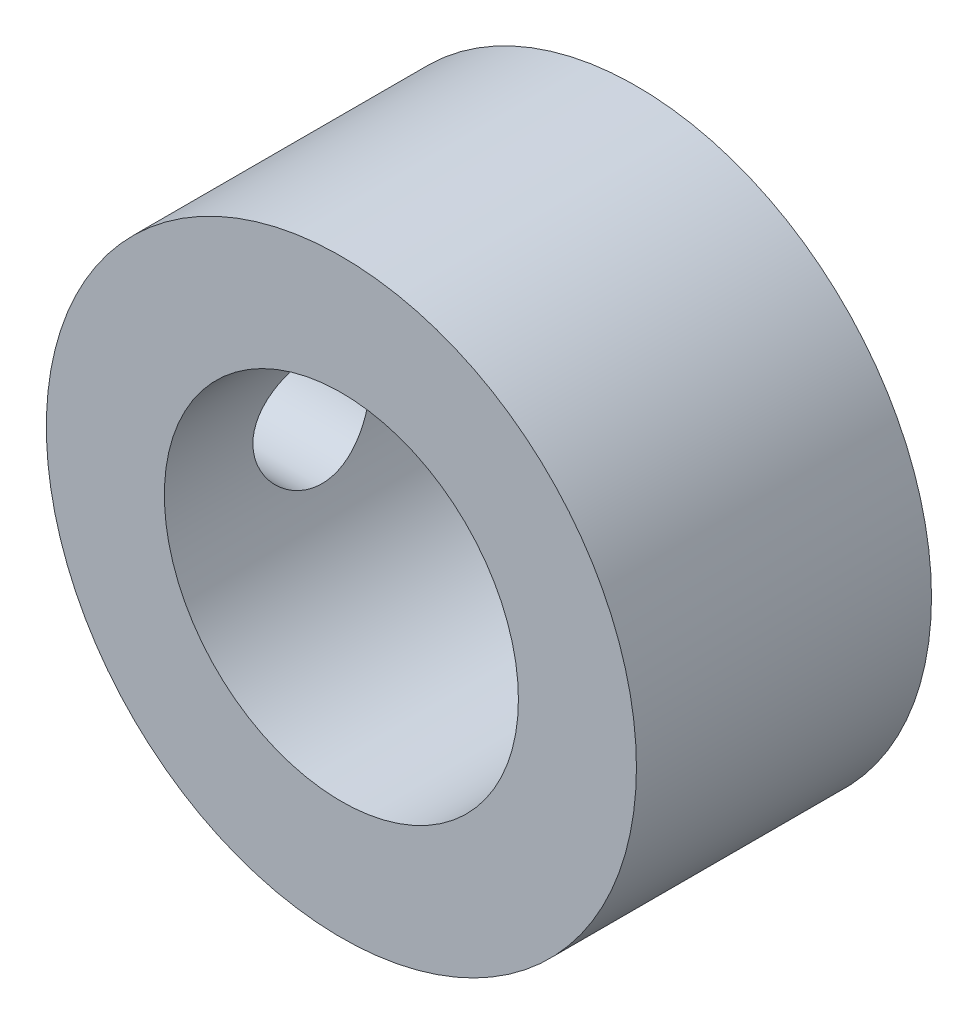
ISO-10303-21;
HEADER;
FILE_DESCRIPTION(('STEP AP214'),'2;1');
FILE_NAME('part.step','',(''),(''),'','','');
FILE_SCHEMA(('AUTOMOTIVE_DESIGN { 1 0 10303 214 1 1 1 1 }'));
ENDSEC;
DATA;
#1=APPLICATION_CONTEXT('core data for automotive mechanical design processes');
#2=APPLICATION_PROTOCOL_DEFINITION('international standard','automotive_design',2000,#1);
#3=PRODUCT_CONTEXT('',#1,'mechanical');
#4=PRODUCT('Part','Part','',(#3));
#5=PRODUCT_RELATED_PRODUCT_CATEGORY('part','',(#4));
#6=PRODUCT_DEFINITION_FORMATION('','',#4);
#7=PRODUCT_DEFINITION_CONTEXT('part definition',#1,'design');
#8=PRODUCT_DEFINITION('design','',#6,#7);
#9=PRODUCT_DEFINITION_SHAPE('','',#8);
#10=(LENGTH_UNIT() NAMED_UNIT(*) SI_UNIT(.MILLI.,.METRE.));
#11=(NAMED_UNIT(*) PLANE_ANGLE_UNIT() SI_UNIT($,.RADIAN.));
#12=(NAMED_UNIT(*) SI_UNIT($,.STERADIAN.) SOLID_ANGLE_UNIT());
#13=UNCERTAINTY_MEASURE_WITH_UNIT(LENGTH_MEASURE(1.E-05),#10,'distance_accuracy_value','');
#14=(GEOMETRIC_REPRESENTATION_CONTEXT(3) GLOBAL_UNCERTAINTY_ASSIGNED_CONTEXT((#13)) GLOBAL_UNIT_ASSIGNED_CONTEXT((#10,
#11,#12)) REPRESENTATION_CONTEXT('',''));
#15=CARTESIAN_POINT('',(0.,0.,0.));
#16=DIRECTION('',(0.,0.,1.));
#17=DIRECTION('',(1.,0.,0.));
#18=AXIS2_PLACEMENT_3D('',#15,#16,#17);
#19=CARTESIAN_POINT('',(0.,0.,10.));
#20=DIRECTION('',(0.,0.,1.));
#21=DIRECTION('',(1.,0.,0.));
#22=AXIS2_PLACEMENT_3D('',#19,#20,#21);
#23=PLANE('',#22);
#24=CARTESIAN_POINT('',(0.,0.,10.));
#25=DIRECTION('',(0.,0.,1.));
#26=DIRECTION('',(1.,0.,0.));
#27=AXIS2_PLACEMENT_3D('',#24,#25,#26);
#28=CIRCLE('',#27,10.);
#29=CARTESIAN_POINT('',(10.,0.,10.));
#30=VERTEX_POINT('',#29);
#31=EDGE_CURVE('E10',#30,#30,#28,.T.);
#32=ORIENTED_EDGE('',*,*,#31,.T.);
#33=EDGE_LOOP('',(#32));
#34=FACE_BOUND('',#33,.T.);
#35=CARTESIAN_POINT('',(0.,0.,10.));
#36=DIRECTION('',(0.,0.,1.));
#37=DIRECTION('',(1.,0.,0.));
#38=AXIS2_PLACEMENT_3D('',#35,#36,#37);
#39=CIRCLE('',#38,6.);
#40=CARTESIAN_POINT('',(6.,0.,10.));
#41=VERTEX_POINT('',#40);
#42=EDGE_CURVE('E51',#41,#41,#39,.T.);
#43=ORIENTED_EDGE('',*,*,#42,.F.);
#44=EDGE_LOOP('',(#43));
#45=FACE_BOUND('',#44,.T.);
#46=ADVANCED_FACE('F32',(#34,#45),#23,.T.);
#47=CARTESIAN_POINT('',(0.,0.,0.));
#48=DIRECTION('',(0.,0.,1.));
#49=DIRECTION('',(1.,0.,0.));
#50=AXIS2_PLACEMENT_3D('',#47,#48,#49);
#51=PLANE('',#50);
#52=CARTESIAN_POINT('',(0.,0.,0.));
#53=DIRECTION('',(0.,0.,1.));
#54=DIRECTION('',(1.,0.,0.));
#55=AXIS2_PLACEMENT_3D('',#52,#53,#54);
#56=CIRCLE('',#55,10.);
#57=CARTESIAN_POINT('',(10.,0.,0.));
#58=VERTEX_POINT('',#57);
#59=EDGE_CURVE('E46',#58,#58,#56,.T.);
#60=ORIENTED_EDGE('',*,*,#59,.F.);
#61=EDGE_LOOP('',(#60));
#62=FACE_BOUND('',#61,.T.);
#63=CARTESIAN_POINT('',(0.,0.,0.));
#64=DIRECTION('',(0.,0.,1.));
#65=DIRECTION('',(1.,0.,0.));
#66=AXIS2_PLACEMENT_3D('',#63,#64,#65);
#67=CIRCLE('',#66,6.);
#68=CARTESIAN_POINT('',(6.,0.,0.));
#69=VERTEX_POINT('',#68);
#70=EDGE_CURVE('E53',#69,#69,#67,.T.);
#71=ORIENTED_EDGE('',*,*,#70,.T.);
#72=EDGE_LOOP('',(#71));
#73=FACE_BOUND('',#72,.T.);
#74=ADVANCED_FACE('F74',(#62,#73),#51,.F.);
#75=CARTESIAN_POINT('',(0.,0.,10.));
#76=DIRECTION('',(0.,0.,-1.));
#77=DIRECTION('',(-1.,0.,0.));
#78=AXIS2_PLACEMENT_3D('',#75,#76,#77);
#79=CYLINDRICAL_SURFACE('',#78,10.);
#80=CARTESIAN_POINT('',(-10.,0.,7.));
#81=CARTESIAN_POINT('',(-9.99999795161742,-0.111153813585266,6.99999591100331));
#82=CARTESIAN_POINT('',(-9.99812770356462,-0.222359320403045,6.99070231406471));
#83=CARTESIAN_POINT('',(-9.99084731246463,-0.441627015378039,6.95380299976951));
#84=CARTESIAN_POINT('',(-9.98543435720372,-0.549686635082712,6.92618273439698));
#85=CARTESIAN_POINT('',(-9.97167298556573,-0.759460610526626,6.85351745275842));
#86=CARTESIAN_POINT('',(-9.96332738153436,-0.861180935866269,6.80848912631062));
#87=CARTESIAN_POINT('',(-9.94460796070629,-1.05561597772845,6.70233550497741));
#88=CARTESIAN_POINT('',(-9.93423426471414,-1.14833123015162,6.64121116878559));
#89=CARTESIAN_POINT('',(-9.9124433065994,-1.32338695462973,6.50372301141713));
#90=CARTESIAN_POINT('',(-9.90101491008695,-1.40558790231705,6.4271832892176));
#91=CARTESIAN_POINT('',(-9.87848360905177,-1.55607351321606,6.26141516721659));
#92=CARTESIAN_POINT('',(-9.86738073000847,-1.62435708954085,6.17218577732976));
#93=CARTESIAN_POINT('',(-9.8466488362523,-1.74566350669524,5.98256761397625));
#94=CARTESIAN_POINT('',(-9.83703414729892,-1.79854187773173,5.88208471240728));
#95=CARTESIAN_POINT('',(-9.82052536116836,-1.88661133316062,5.67343636199184));
#96=CARTESIAN_POINT('',(-9.81363099523923,-1.92180416487448,5.56527167330731));
#97=CARTESIAN_POINT('',(-9.80345610504409,-1.97305059976965,5.34583127218417));
#98=CARTESIAN_POINT('',(-9.80012940214375,-1.98934899591755,5.23461491171555));
#99=CARTESIAN_POINT('',(-9.79732750121254,-2.00310425545224,5.01098035727132));
#100=CARTESIAN_POINT('',(-9.79785190935681,-2.000563045427,4.89856228735971));
#101=CARTESIAN_POINT('',(-9.80265102296369,-1.97690914620364,4.67750642395799));
#102=CARTESIAN_POINT('',(-9.80686905717527,-1.95607708048781,4.56883718874537));
#103=CARTESIAN_POINT('',(-9.81849092320002,-1.8968757692461,4.356567846674));
#104=CARTESIAN_POINT('',(-9.82589490715558,-1.85850568620136,4.25296798216198));
#105=CARTESIAN_POINT('',(-9.84311237000816,-1.76504956734944,4.0529694765928));
#106=CARTESIAN_POINT('',(-9.85294179627409,-1.70985230246423,3.95662424086166));
#107=CARTESIAN_POINT('',(-9.87389237546124,-1.58438714914536,3.77445830005437));
#108=CARTESIAN_POINT('',(-9.88501367676732,-1.51411752871366,3.68863880629769));
#109=CARTESIAN_POINT('',(-9.90754042482924,-1.35899986912117,3.52834119508613));
#110=CARTESIAN_POINT('',(-9.9189473842181,-1.27391232242489,3.45409486428174));
#111=CARTESIAN_POINT('',(-9.94057697428817,-1.09237004812402,3.32089230739755));
#112=CARTESIAN_POINT('',(-9.95079958977947,-0.995915174758779,3.26193627741284));
#113=CARTESIAN_POINT('',(-9.96893380321774,-0.794118773757842,3.16094498154805));
#114=CARTESIAN_POINT('',(-9.97684177696544,-0.6887636391706,3.11893621271093));
#115=CARTESIAN_POINT('',(-9.98942817975716,-0.472297952897329,3.05327905192287));
#116=CARTESIAN_POINT('',(-9.99410700001063,-0.361188100144899,3.02962843585274));
#117=CARTESIAN_POINT('',(-9.99965343733736,-0.138358811254301,3.00168709241145));
#118=CARTESIAN_POINT('',(-10.0005834930494,-0.0266806566511523,2.99707916091946));
#119=CARTESIAN_POINT('',(-9.99870103860205,0.195849868385428,3.00649971788436));
#120=CARTESIAN_POINT('',(-9.99588873882892,0.306702284887586,3.02052715870519));
#121=CARTESIAN_POINT('',(-9.98687664016035,0.523411319893082,3.06655674708791));
#122=CARTESIAN_POINT('',(-9.98070752808413,0.629303896679806,3.09839613699581));
#123=CARTESIAN_POINT('',(-9.96567104122065,0.834247254999334,3.17896796531162));
#124=CARTESIAN_POINT('',(-9.95680346428453,0.933297523275079,3.22770166935366));
#125=CARTESIAN_POINT('',(-9.93719823066589,1.12308234737244,3.34136498130262));
#126=CARTESIAN_POINT('',(-9.92643900874104,1.21370025350438,3.40648556207789));
#127=CARTESIAN_POINT('',(-9.90429469659765,1.38283603823841,3.55081838241456));
#128=CARTESIAN_POINT('',(-9.89290953936776,1.46135261786152,3.63003213279973));
#129=CARTESIAN_POINT('',(-9.8705860711393,1.60528118154835,3.80174670378225));
#130=CARTESIAN_POINT('',(-9.85965720466609,1.67047540489731,3.89443148844267));
#131=CARTESIAN_POINT('',(-9.83968383592389,1.78437084010241,4.08962272271336));
#132=CARTESIAN_POINT('',(-9.83063925826685,1.83307271184581,4.19212877914711));
#133=CARTESIAN_POINT('',(-9.81553481168766,1.91230368316392,4.4035364922991));
#134=CARTESIAN_POINT('',(-9.80945949744373,1.9429269995821,4.51240168242064));
#135=CARTESIAN_POINT('',(-9.8009487358405,1.98541730325439,4.73386690698181));
#136=CARTESIAN_POINT('',(-9.79851281382223,1.99728673645023,4.84646645241869));
#137=CARTESIAN_POINT('',(-9.79758299262758,2.00184182173494,5.07001772908864));
#138=CARTESIAN_POINT('',(-9.79901838378602,1.99487157614179,5.18096229785402));
#139=CARTESIAN_POINT('',(-9.80551146969228,1.96270460820012,5.40006329981005));
#140=CARTESIAN_POINT('',(-9.81056913534338,1.9375080322586,5.50821975538961));
#141=CARTESIAN_POINT('',(-9.82370528438317,1.86975713699791,5.71845542248109));
#142=CARTESIAN_POINT('',(-9.83177642037661,1.82724501343469,5.82054872100483));
#143=CARTESIAN_POINT('',(-9.85003429948341,1.72610928920321,6.01620744146888));
#144=CARTESIAN_POINT('',(-9.86022121997788,1.66748433754977,6.10977214745028));
#145=CARTESIAN_POINT('',(-9.88177921046451,1.53461182957283,6.28743114430063));
#146=CARTESIAN_POINT('',(-9.89316745819399,1.46011577447036,6.37133753053519));
#147=CARTESIAN_POINT('',(-9.91572163743909,1.29812873802628,6.52557241105834));
#148=CARTESIAN_POINT('',(-9.92688751726369,1.21063477430667,6.59589778063454));
#149=CARTESIAN_POINT('',(-9.94787664775943,1.02403525817649,6.72166928789289));
#150=CARTESIAN_POINT('',(-9.95768462438492,0.92481776885967,6.77695200656005));
#151=CARTESIAN_POINT('',(-9.9747025017,0.718332721881465,6.86997224519318));
#152=CARTESIAN_POINT('',(-9.98191474277232,0.611072521726253,6.90772557906499));
#153=CARTESIAN_POINT('',(-9.99152745190741,0.419642977847559,6.95730389608943));
#154=CARTESIAN_POINT('',(-9.99468606316904,0.336563328027569,6.97328638741551));
#155=CARTESIAN_POINT('',(-9.99892308279786,0.168999050420133,6.99463582471673));
#156=CARTESIAN_POINT('',(-10.0000015574631,0.0845144674972378,7.00000310901954));
#157=CARTESIAN_POINT('',(-10.,0.,7.));
#158=B_SPLINE_CURVE_WITH_KNOTS('',3,(#80,#81,#82,#83,#84,#85,#86,#87,#88,#89,#90,#91,#92,#93,
#94,#95,#96,#97,#98,#99,#100,#101,#102,#103,#104,#105,#106,#107,#108,#109,#110,#111,#112,#113,
#114,#115,#116,#117,#118,#119,#120,#121,#122,#123,#124,#125,#126,#127,#128,#129,#130,#131,#132,
#133,#134,#135,#136,#137,#138,#139,#140,#141,#142,#143,#144,#145,#146,#147,#148,#149,#150,#151,
#152,#153,#154,#155,#156,#157),.UNSPECIFIED.,.T.,.F.,(4,2,2,2,2,2,2,2,2,2,2,2,2,2,2,2,2,2,2,2,2,
2,2,2,2,2,2,2,2,2,2,2,2,2,2,2,2,2,4),(0.,0.333152261322517,0.666569301382646,0.999667470500684,
1.33274580446173,1.66986534022437,2.00701119349473,2.34722390011846,2.68740298730395,
3.02312370207175,3.3588100856245,3.68943454012557,4.02007478507459,4.35294980407185,
4.68586309499341,5.02476504982701,5.36367135079641,5.70310549708048,6.04249851396072,
6.37621471352531,6.70991215315735,7.04060907901447,7.37133078432045,7.70610132066717,
8.0409077669186,8.38081257158452,8.72070377446933,9.05880762065446,9.39686736660829,
9.72879445135403,10.0607188698522,10.3918392250622,10.7229873516373,11.0597615247829,
11.3966130906586,11.7369899335127,12.0770591103504,12.3303755057979,12.5836838274199),.UNSPECIFIED.);
#159=CARTESIAN_POINT('',(-10.,0.,7.));
#160=VERTEX_POINT('',#159);
#161=EDGE_CURVE('E56',#160,#160,#158,.T.);
#162=ORIENTED_EDGE('',*,*,#161,.T.);
#163=EDGE_LOOP('',(#162));
#164=FACE_BOUND('',#163,.T.);
#165=ORIENTED_EDGE('',*,*,#31,.F.);
#166=EDGE_LOOP('',(#165));
#167=FACE_BOUND('',#166,.T.);
#168=ORIENTED_EDGE('',*,*,#59,.T.);
#169=EDGE_LOOP('',(#168));
#170=FACE_BOUND('',#169,.T.);
#171=ADVANCED_FACE('F34',(#164,#167,#170),#79,.T.);
#172=CARTESIAN_POINT('',(0.,0.,10.));
#173=DIRECTION('',(0.,0.,-1.));
#174=DIRECTION('',(-1.,0.,0.));
#175=AXIS2_PLACEMENT_3D('',#172,#173,#174);
#176=CYLINDRICAL_SURFACE('',#175,6.);
#177=CARTESIAN_POINT('',(-6.,0.,7.));
#178=CARTESIAN_POINT('',(-6.00000030601888,-0.109126725773446,7.00000050746328));
#179=CARTESIAN_POINT('',(-5.9969953901509,-0.2182503890771,6.99103946774557));
#180=CARTESIAN_POINT('',(-5.98530420406562,-0.433283521745945,6.95554178236556));
#181=CARTESIAN_POINT('',(-5.97661734404305,-0.539192656237636,6.92900331210216));
#182=CARTESIAN_POINT('',(-5.95450615812885,-0.744665579003552,6.8593615132319));
#183=CARTESIAN_POINT('',(-5.94108975461707,-0.844239651772069,6.81628587508146));
#184=CARTESIAN_POINT('',(-5.91088891434684,-1.03474987361065,6.71491765432331));
#185=CARTESIAN_POINT('',(-5.89410381335556,-1.12568431391741,6.6566220699948));
#186=CARTESIAN_POINT('',(-5.8582818888601,-1.29948335004453,6.5243483902825));
#187=CARTESIAN_POINT('',(-5.8391911292757,-1.38200740059662,6.44993753147901));
#188=CARTESIAN_POINT('',(-5.80120629566243,-1.53366538540417,6.28846569058687));
#189=CARTESIAN_POINT('',(-5.78231226581098,-1.60279637097893,6.20140193014298));
#190=CARTESIAN_POINT('',(-5.74626664954548,-1.72764988445572,6.01402976960708));
#191=CARTESIAN_POINT('',(-5.72918078551376,-1.78292971644206,5.91341252053576));
#192=CARTESIAN_POINT('',(-5.69950610837202,-1.87563774775544,5.70364781108291));
#193=CARTESIAN_POINT('',(-5.68691592321491,-1.91307139477353,5.59450296567451));
#194=CARTESIAN_POINT('',(-5.66822606538755,-1.96774692301833,5.37465355700658));
#195=CARTESIAN_POINT('',(-5.66192191539223,-1.98562689654354,5.26412558302187));
#196=CARTESIAN_POINT('',(-5.65591313259015,-2.00268224666895,5.04147249168824));
#197=CARTESIAN_POINT('',(-5.6562064604546,-2.00186340320944,4.92934787858162));
#198=CARTESIAN_POINT('',(-5.6631803001636,-1.98203980740684,4.71212673911196));
#199=CARTESIAN_POINT('',(-5.66956831735066,-1.96386782633399,4.60694319416196));
#200=CARTESIAN_POINT('',(-5.68753315449102,-1.91121232569883,4.40121316078633));
#201=CARTESIAN_POINT('',(-5.69911059568215,-1.87672685318374,4.30066722912986));
#202=CARTESIAN_POINT('',(-5.72635822262498,-1.79187811612042,4.10517450081704));
#203=CARTESIAN_POINT('',(-5.74209131586235,-1.74126809741453,4.01034394906095));
#204=CARTESIAN_POINT('',(-5.77585117151453,-1.62577821260628,3.83025818344055));
#205=CARTESIAN_POINT('',(-5.79387859580927,-1.56089422472801,3.74500574613324));
#206=CARTESIAN_POINT('',(-5.83134658335482,-1.41469866536447,3.58181680367845));
#207=CARTESIAN_POINT('',(-5.85081178709686,-1.33270630015262,3.50449461098186));
#208=CARTESIAN_POINT('',(-5.88813876774073,-1.15667913994013,3.3645374666732));
#209=CARTESIAN_POINT('',(-5.90600039076135,-1.06264319132163,3.30190392367101));
#210=CARTESIAN_POINT('',(-5.93834215875587,-0.863895226092535,3.19260739952986));
#211=CARTESIAN_POINT('',(-5.95278700016078,-0.759086552832673,3.14610901731854));
#212=CARTESIAN_POINT('',(-5.9764113428887,-0.542538166729015,3.07159365208858));
#213=CARTESIAN_POINT('',(-5.98559267309759,-0.430800876309907,3.04357024915312));
#214=CARTESIAN_POINT('',(-5.99735254142881,-0.208767659058608,3.00788866795528));
#215=CARTESIAN_POINT('',(-6.00020003667456,-0.0986191997296923,2.9994003816545));
#216=CARTESIAN_POINT('',(-5.99977805389655,0.121550139920475,3.00066534719694));
#217=CARTESIAN_POINT('',(-5.99650960838725,0.231571038639301,3.01041551995975));
#218=CARTESIAN_POINT('',(-5.98440049434209,0.445039732608512,3.04722381547192));
#219=CARTESIAN_POINT('',(-5.97572397422385,0.548585613669687,3.07377241209899));
#220=CARTESIAN_POINT('',(-5.9538369366014,0.749711917159147,3.14278688893346));
#221=CARTESIAN_POINT('',(-5.9406258409335,0.847291577017213,3.18525479893557));
#222=CARTESIAN_POINT('',(-5.91057862574579,1.03657659278655,3.28614086368157));
#223=CARTESIAN_POINT('',(-5.89365629511572,1.12805991843429,3.34494918656634));
#224=CARTESIAN_POINT('',(-5.85810507832525,1.30012966027117,3.47638830002697));
#225=CARTESIAN_POINT('',(-5.83947567187655,1.38071273559115,3.54902331206353));
#226=CARTESIAN_POINT('',(-5.8015369596089,1.5325050156126,3.70995750201318));
#227=CARTESIAN_POINT('',(-5.78223522174856,1.60312193849154,3.79881845385372));
#228=CARTESIAN_POINT('',(-5.74599946589417,1.72851504464715,3.98754313562177));
#229=CARTESIAN_POINT('',(-5.72906546764005,1.78329109586203,4.08740695726815));
#230=CARTESIAN_POINT('',(-5.69964783582767,1.87519386083272,4.29534603057979));
#231=CARTESIAN_POINT('',(-5.68715521585958,1.91235626433004,4.40340415833753));
#232=CARTESIAN_POINT('',(-5.66821664612899,1.96778933351871,4.62475730008826));
#233=CARTESIAN_POINT('',(-5.66176797247279,1.98606850990788,4.7380499308087));
#234=CARTESIAN_POINT('',(-5.65595717748354,2.00255256495468,4.96039419208183));
#235=CARTESIAN_POINT('',(-5.6562480051483,2.0017405146168,5.06936468057365));
#236=CARTESIAN_POINT('',(-5.66302539647735,1.98248458689739,5.28553014984413));
#237=CARTESIAN_POINT('',(-5.66951159138723,1.96404175891717,5.39272523591018));
#238=CARTESIAN_POINT('',(-5.68769048609783,1.91074362625869,5.60027132600495));
#239=CARTESIAN_POINT('',(-5.69928196044955,1.87620669203103,5.70071365000899));
#240=CARTESIAN_POINT('',(-5.72632797636937,1.79195873151949,5.89445481387654));
#241=CARTESIAN_POINT('',(-5.74178337526786,1.74224433710761,5.98775206237601));
#242=CARTESIAN_POINT('',(-5.77565658452093,1.62652138516686,6.16896733984582));
#243=CARTESIAN_POINT('',(-5.79417423284274,1.55989648552916,6.25647300379677));
#244=CARTESIAN_POINT('',(-5.83166712566506,1.4132857662713,6.4193796267684));
#245=CARTESIAN_POINT('',(-5.85064249824745,1.33329616890296,6.49477715137615));
#246=CARTESIAN_POINT('',(-5.88780061051088,1.15848311384138,6.63428882457836));
#247=CARTESIAN_POINT('',(-5.90592363602513,1.06320302699946,6.697848695502));
#248=CARTESIAN_POINT('',(-5.93851982345224,0.862714714813249,6.80798085770129));
#249=CARTESIAN_POINT('',(-5.9529939181586,0.757509036264697,6.85455749184409));
#250=CARTESIAN_POINT('',(-5.97611030137084,0.544987294401952,6.92744326497734));
#251=CARTESIAN_POINT('',(-5.98498424845045,0.437975515352817,6.95456493252675));
#252=CARTESIAN_POINT('',(-5.99692814128444,0.220640832020494,6.99084056135425));
#253=CARTESIAN_POINT('',(-5.9999996906381,0.110318851137493,6.99999948699307));
#254=CARTESIAN_POINT('',(-6.,0.,7.));
#255=B_SPLINE_CURVE_WITH_KNOTS('',3,(#177,#178,#179,#180,#181,#182,#183,#184,#185,#186,#187,
#188,#189,#190,#191,#192,#193,#194,#195,#196,#197,#198,#199,#200,#201,#202,#203,#204,#205,#206,
#207,#208,#209,#210,#211,#212,#213,#214,#215,#216,#217,#218,#219,#220,#221,#222,#223,#224,#225,
#226,#227,#228,#229,#230,#231,#232,#233,#234,#235,#236,#237,#238,#239,#240,#241,#242,#243,#244,
#245,#246,#247,#248,#249,#250,#251,#252,#253,#254),.UNSPECIFIED.,.T.,.F.,(4,2,2,2,2,2,2,2,2,2,2,
2,2,2,2,2,2,2,2,2,2,2,2,2,2,2,2,2,2,2,2,2,2,2,2,2,2,2,4),(0.,0.326974212052022,
0.653982370535041,0.980445345740548,1.3069727555982,1.64369368565512,1.98048866575061,
2.32696769646941,2.67334089385667,3.0080385148368,3.34263267974971,3.66193653102561,
3.98127861710964,4.30576342310261,4.63034205116414,4.97186611622734,5.31342291933237,
5.65836811300715,6.00319337754417,6.33307166350339,6.66289426328353,6.98316315956427,
7.30347290568208,7.63220799687473,7.96104361643783,8.30482045761504,8.64860016469994,
8.99168027653541,9.3346056941168,9.65991332128517,9.98520158702751,10.3043117416084,
10.6234927635196,10.9566013338361,11.2898042224756,11.635993216702,11.9820936230491,
12.3127311674763,12.6432773207628),.UNSPECIFIED.);
#256=CARTESIAN_POINT('',(-6.,0.,7.));
#257=VERTEX_POINT('',#256);
#258=EDGE_CURVE('E37',#257,#257,#255,.T.);
#259=ORIENTED_EDGE('',*,*,#258,.F.);
#260=EDGE_LOOP('',(#259));
#261=FACE_BOUND('',#260,.T.);
#262=ORIENTED_EDGE('',*,*,#42,.T.);
#263=EDGE_LOOP('',(#262));
#264=FACE_BOUND('',#263,.T.);
#265=ORIENTED_EDGE('',*,*,#70,.F.);
#266=EDGE_LOOP('',(#265));
#267=FACE_BOUND('',#266,.T.);
#268=ADVANCED_FACE('F66',(#261,#264,#267),#176,.F.);
#269=CARTESIAN_POINT('',(-18.,0.,5.));
#270=DIRECTION('',(1.,0.,0.));
#271=DIRECTION('',(0.,0.,-1.));
#272=AXIS2_PLACEMENT_3D('',#269,#270,#271);
#273=CYLINDRICAL_SURFACE('',#272,2.);
#274=ORIENTED_EDGE('',*,*,#258,.T.);
#275=EDGE_LOOP('',(#274));
#276=FACE_BOUND('',#275,.T.);
#277=ORIENTED_EDGE('',*,*,#161,.F.);
#278=EDGE_LOOP('',(#277));
#279=FACE_BOUND('',#278,.T.);
#280=ADVANCED_FACE('F63',(#276,#279),#273,.F.);
#281=CLOSED_SHELL('',(#46,#74,#171,#268,#280));
#282=MANIFOLD_SOLID_BREP('B2',#281);
#283=ADVANCED_BREP_SHAPE_REPRESENTATION('',(#18,#282),#14);
#284=SHAPE_DEFINITION_REPRESENTATION(#9,#283);
ENDSEC;
END-ISO-10303-21;
